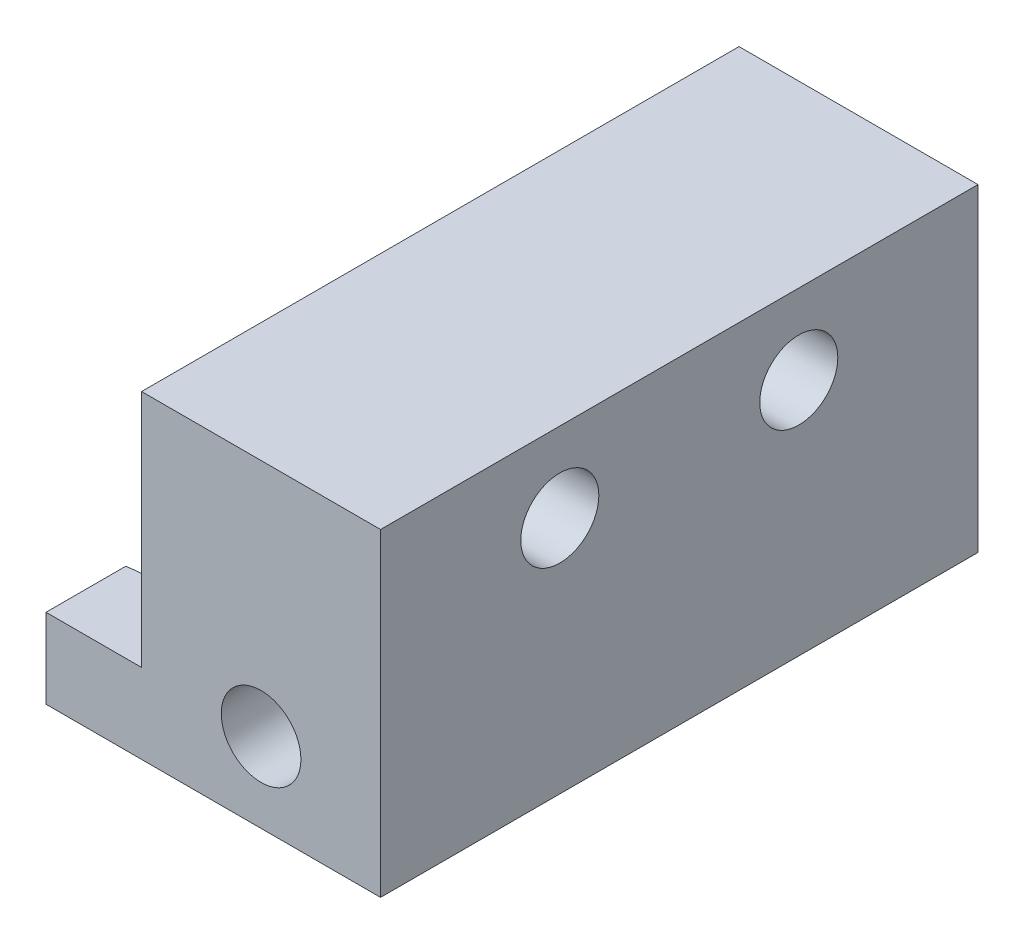
ISO-10303-21;
HEADER;
FILE_DESCRIPTION(('STEP AP214'),'2;1');
FILE_NAME('part.step','',(''),(''),'','','');
FILE_SCHEMA(('AUTOMOTIVE_DESIGN { 1 0 10303 214 1 1 1 1 }'));
ENDSEC;
DATA;
#1=APPLICATION_CONTEXT('core data for automotive mechanical design processes');
#2=APPLICATION_PROTOCOL_DEFINITION('international standard','automotive_design',2000,#1);
#3=PRODUCT_CONTEXT('',#1,'mechanical');
#4=PRODUCT('Part','Part','',(#3));
#5=PRODUCT_RELATED_PRODUCT_CATEGORY('part','',(#4));
#6=PRODUCT_DEFINITION_FORMATION('','',#4);
#7=PRODUCT_DEFINITION_CONTEXT('part definition',#1,'design');
#8=PRODUCT_DEFINITION('design','',#6,#7);
#9=PRODUCT_DEFINITION_SHAPE('','',#8);
#10=(LENGTH_UNIT() NAMED_UNIT(*) SI_UNIT(.MILLI.,.METRE.));
#11=(NAMED_UNIT(*) PLANE_ANGLE_UNIT() SI_UNIT($,.RADIAN.));
#12=(NAMED_UNIT(*) SI_UNIT($,.STERADIAN.) SOLID_ANGLE_UNIT());
#13=UNCERTAINTY_MEASURE_WITH_UNIT(LENGTH_MEASURE(1.E-05),#10,'distance_accuracy_value','');
#14=(GEOMETRIC_REPRESENTATION_CONTEXT(3) GLOBAL_UNCERTAINTY_ASSIGNED_CONTEXT((#13)) GLOBAL_UNIT_ASSIGNED_CONTEXT((#10,
#11,#12)) REPRESENTATION_CONTEXT('',''));
#15=CARTESIAN_POINT('',(0.,0.,0.));
#16=DIRECTION('',(0.,0.,1.));
#17=DIRECTION('',(1.,0.,0.));
#18=AXIS2_PLACEMENT_3D('',#15,#16,#17);
#19=CARTESIAN_POINT('',(0.,-20.,0.));
#20=DIRECTION('',(0.,1.,0.));
#21=DIRECTION('',(0.,0.,1.));
#22=AXIS2_PLACEMENT_3D('',#19,#20,#21);
#23=PLANE('',#22);
#24=CARTESIAN_POINT('',(-25.,-20.,-15.5999999999997));
#25=DIRECTION('',(0.,1.,0.));
#26=DIRECTION('',(0.,0.,1.));
#27=AXIS2_PLACEMENT_3D('',#24,#25,#26);
#28=CIRCLE('',#27,10.1000000000003);
#29=CARTESIAN_POINT('',(-27.,-20.,-25.5));
#30=VERTEX_POINT('',#29);
#31=CARTESIAN_POINT('',(-25.,-20.,-25.7));
#32=VERTEX_POINT('',#31);
#33=EDGE_CURVE('E194',#30,#32,#28,.F.);
#34=ORIENTED_EDGE('',*,*,#33,.T.);
#35=CARTESIAN_POINT('',(-25.,-20.,-25.5));
#36=DIRECTION('',(0.,1.,0.));
#37=DIRECTION('',(0.,0.,1.));
#38=AXIS2_PLACEMENT_3D('',#35,#36,#37);
#39=CIRCLE('',#38,0.199999999999997);
#40=CARTESIAN_POINT('',(-24.8,-20.,-25.5));
#41=VERTEX_POINT('',#40);
#42=EDGE_CURVE('E349',#32,#41,#39,.F.);
#43=ORIENTED_EDGE('',*,*,#42,.T.);
#44=DIRECTION('',(1.,0.,0.));
#45=VECTOR('',#44,1.);
#46=CARTESIAN_POINT('',(0.,-20.,-25.5));
#47=LINE('',#46,#45);
#48=CARTESIAN_POINT('',(-15.,-20.,-25.5));
#49=VERTEX_POINT('',#48);
#50=EDGE_CURVE('E355',#41,#49,#47,.T.);
#51=ORIENTED_EDGE('',*,*,#50,.T.);
#52=DIRECTION('',(0.,0.,1.));
#53=VECTOR('',#52,1.);
#54=CARTESIAN_POINT('',(-15.,-20.,0.));
#55=LINE('',#54,#53);
#56=CARTESIAN_POINT('',(-15.,-20.,-27.5));
#57=VERTEX_POINT('',#56);
#58=EDGE_CURVE('E477',#57,#49,#55,.T.);
#59=ORIENTED_EDGE('',*,*,#58,.F.);
#60=DIRECTION('',(1.,0.,0.));
#61=VECTOR('',#60,1.);
#62=CARTESIAN_POINT('',(0.,-20.,-27.5));
#63=LINE('',#62,#61);
#64=CARTESIAN_POINT('',(-24.8,-20.,-27.5));
#65=VERTEX_POINT('',#64);
#66=EDGE_CURVE('E471',#65,#57,#63,.T.);
#67=ORIENTED_EDGE('',*,*,#66,.F.);
#68=CARTESIAN_POINT('',(-25.,-20.,-27.5));
#69=DIRECTION('',(0.,1.,0.));
#70=DIRECTION('',(0.,0.,1.));
#71=AXIS2_PLACEMENT_3D('',#68,#69,#70);
#72=CIRCLE('',#71,0.199999999999997);
#73=CARTESIAN_POINT('',(-25.,-20.,-27.3));
#74=VERTEX_POINT('',#73);
#75=EDGE_CURVE('E467',#74,#65,#72,.T.);
#76=ORIENTED_EDGE('',*,*,#75,.F.);
#77=CARTESIAN_POINT('',(-25.,-20.,-37.4000000000002));
#78=DIRECTION('',(0.,1.,0.));
#79=DIRECTION('',(0.,0.,1.));
#80=AXIS2_PLACEMENT_3D('',#77,#78,#79);
#81=CIRCLE('',#80,10.1000000000003);
#82=CARTESIAN_POINT('',(-27.,-20.,-27.5));
#83=VERTEX_POINT('',#82);
#84=EDGE_CURVE('E206',#83,#74,#81,.T.);
#85=ORIENTED_EDGE('',*,*,#84,.F.);
#86=DIRECTION('',(0.,0.,-1.));
#87=VECTOR('',#86,1.);
#88=CARTESIAN_POINT('',(-27.,-20.,0.));
#89=LINE('',#88,#87);
#90=CARTESIAN_POINT('',(-27.,-20.,-37.5));
#91=VERTEX_POINT('',#90);
#92=EDGE_CURVE('E225',#83,#91,#89,.T.);
#93=ORIENTED_EDGE('',*,*,#92,.T.);
#94=DIRECTION('',(-1.,0.,0.));
#95=VECTOR('',#94,1.);
#96=CARTESIAN_POINT('',(-15.,-20.,-37.5));
#97=LINE('',#96,#95);
#98=CARTESIAN_POINT('',(15.,-20.,-37.5));
#99=VERTEX_POINT('',#98);
#100=EDGE_CURVE('E287',#99,#91,#97,.T.);
#101=ORIENTED_EDGE('',*,*,#100,.F.);
#102=DIRECTION('',(0.,0.,-1.));
#103=VECTOR('',#102,1.);
#104=CARTESIAN_POINT('',(15.,-20.,-37.5));
#105=LINE('',#104,#103);
#106=CARTESIAN_POINT('',(15.,-20.,37.5));
#107=VERTEX_POINT('',#106);
#108=EDGE_CURVE('E268',#107,#99,#105,.T.);
#109=ORIENTED_EDGE('',*,*,#108,.F.);
#110=DIRECTION('',(1.,0.,0.));
#111=VECTOR('',#110,1.);
#112=CARTESIAN_POINT('',(-15.,-20.,37.5));
#113=LINE('',#112,#111);
#114=CARTESIAN_POINT('',(-27.,-20.,37.5));
#115=VERTEX_POINT('',#114);
#116=EDGE_CURVE('E274',#115,#107,#113,.T.);
#117=ORIENTED_EDGE('',*,*,#116,.F.);
#118=CARTESIAN_POINT('',(-27.,-20.,27.5));
#119=VERTEX_POINT('',#118);
#120=EDGE_CURVE('E224',#115,#119,#89,.T.);
#121=ORIENTED_EDGE('',*,*,#120,.T.);
#122=CARTESIAN_POINT('',(-25.,-20.,37.4000000000002));
#123=DIRECTION('',(0.,-1.,0.));
#124=DIRECTION('',(0.,0.,-1.));
#125=AXIS2_PLACEMENT_3D('',#122,#123,#124);
#126=CIRCLE('',#125,10.1000000000003);
#127=CARTESIAN_POINT('',(-25.,-20.,27.3));
#128=VERTEX_POINT('',#127);
#129=EDGE_CURVE('E390',#119,#128,#126,.T.);
#130=ORIENTED_EDGE('',*,*,#129,.T.);
#131=CARTESIAN_POINT('',(-25.,-20.,27.5));
#132=DIRECTION('',(0.,-1.,0.));
#133=DIRECTION('',(0.,0.,-1.));
#134=AXIS2_PLACEMENT_3D('',#131,#132,#133);
#135=CIRCLE('',#134,0.199999999999997);
#136=CARTESIAN_POINT('',(-24.8,-20.,27.5));
#137=VERTEX_POINT('',#136);
#138=EDGE_CURVE('E386',#128,#137,#135,.T.);
#139=ORIENTED_EDGE('',*,*,#138,.T.);
#140=DIRECTION('',(1.,0.,0.));
#141=VECTOR('',#140,1.);
#142=CARTESIAN_POINT('',(0.,-20.,27.5));
#143=LINE('',#142,#141);
#144=CARTESIAN_POINT('',(-15.,-20.,27.5));
#145=VERTEX_POINT('',#144);
#146=EDGE_CURVE('E382',#137,#145,#143,.T.);
#147=ORIENTED_EDGE('',*,*,#146,.T.);
#148=DIRECTION('',(0.,0.,-1.));
#149=VECTOR('',#148,1.);
#150=CARTESIAN_POINT('',(-15.,-20.,0.));
#151=LINE('',#150,#149);
#152=CARTESIAN_POINT('',(-15.,-20.,25.5));
#153=VERTEX_POINT('',#152);
#154=EDGE_CURVE('E378',#145,#153,#151,.T.);
#155=ORIENTED_EDGE('',*,*,#154,.T.);
#156=DIRECTION('',(1.,0.,0.));
#157=VECTOR('',#156,1.);
#158=CARTESIAN_POINT('',(0.,-20.,25.5));
#159=LINE('',#158,#157);
#160=CARTESIAN_POINT('',(-24.8,-20.,25.5));
#161=VERTEX_POINT('',#160);
#162=EDGE_CURVE('E374',#161,#153,#159,.T.);
#163=ORIENTED_EDGE('',*,*,#162,.F.);
#164=CARTESIAN_POINT('',(-25.,-20.,25.5));
#165=DIRECTION('',(0.,-1.,0.));
#166=DIRECTION('',(0.,0.,-1.));
#167=AXIS2_PLACEMENT_3D('',#164,#165,#166);
#168=CIRCLE('',#167,0.199999999999997);
#169=CARTESIAN_POINT('',(-25.,-20.,25.7));
#170=VERTEX_POINT('',#169);
#171=EDGE_CURVE('E371',#170,#161,#168,.F.);
#172=ORIENTED_EDGE('',*,*,#171,.F.);
#173=CARTESIAN_POINT('',(-25.,-20.,15.5999999999997));
#174=DIRECTION('',(0.,-1.,0.));
#175=DIRECTION('',(0.,0.,-1.));
#176=AXIS2_PLACEMENT_3D('',#173,#174,#175);
#177=CIRCLE('',#176,10.1000000000003);
#178=CARTESIAN_POINT('',(-27.,-20.,25.5));
#179=VERTEX_POINT('',#178);
#180=EDGE_CURVE('E222',#179,#170,#177,.F.);
#181=ORIENTED_EDGE('',*,*,#180,.F.);
#182=EDGE_CURVE('E213',#179,#30,#89,.T.);
#183=ORIENTED_EDGE('',*,*,#182,.T.);
#184=EDGE_LOOP('',(#34,#43,#51,#59,#67,#76,#85,#93,#101,#109,#117,#121,#130,#139,#147,#155,#163,
#172,#181,#183));
#185=FACE_BOUND('',#184,.T.);
#186=ADVANCED_FACE('F45',(#185),#23,.F.);
#187=CARTESIAN_POINT('',(0.,-10.,0.));
#188=DIRECTION('',(0.,-1.,0.));
#189=DIRECTION('',(0.,0.,-1.));
#190=AXIS2_PLACEMENT_3D('',#187,#188,#189);
#191=PLANE('',#190);
#192=CARTESIAN_POINT('',(-25.,-10.,-15.5999999999997));
#193=DIRECTION('',(0.,-1.,0.));
#194=DIRECTION('',(0.,0.,-1.));
#195=AXIS2_PLACEMENT_3D('',#192,#193,#194);
#196=CIRCLE('',#195,10.1000000000003);
#197=CARTESIAN_POINT('',(-27.,-10.,-25.5));
#198=VERTEX_POINT('',#197);
#199=CARTESIAN_POINT('',(-25.,-10.,-25.7));
#200=VERTEX_POINT('',#199);
#201=EDGE_CURVE('E361',#198,#200,#196,.T.);
#202=ORIENTED_EDGE('',*,*,#201,.F.);
#203=DIRECTION('',(0.,0.,-1.));
#204=VECTOR('',#203,1.);
#205=CARTESIAN_POINT('',(-27.,-10.,0.));
#206=LINE('',#205,#204);
#207=CARTESIAN_POINT('',(-27.,-10.,25.5));
#208=VERTEX_POINT('',#207);
#209=EDGE_CURVE('E215',#208,#198,#206,.T.);
#210=ORIENTED_EDGE('',*,*,#209,.F.);
#211=CARTESIAN_POINT('',(-25.,-10.,15.5999999999997));
#212=DIRECTION('',(0.,-1.,0.));
#213=DIRECTION('',(0.,0.,-1.));
#214=AXIS2_PLACEMENT_3D('',#211,#212,#213);
#215=CIRCLE('',#214,10.1000000000003);
#216=CARTESIAN_POINT('',(-25.,-10.,25.7));
#217=VERTEX_POINT('',#216);
#218=EDGE_CURVE('E316',#208,#217,#215,.F.);
#219=ORIENTED_EDGE('',*,*,#218,.T.);
#220=CARTESIAN_POINT('',(-25.,-10.,25.5));
#221=DIRECTION('',(0.,-1.,0.));
#222=DIRECTION('',(0.,0.,-1.));
#223=AXIS2_PLACEMENT_3D('',#220,#221,#222);
#224=CIRCLE('',#223,0.199999999999997);
#225=CARTESIAN_POINT('',(-24.8,-10.,25.5));
#226=VERTEX_POINT('',#225);
#227=EDGE_CURVE('E308',#217,#226,#224,.F.);
#228=ORIENTED_EDGE('',*,*,#227,.T.);
#229=DIRECTION('',(1.,0.,0.));
#230=VECTOR('',#229,1.);
#231=CARTESIAN_POINT('',(0.,-10.,25.5));
#232=LINE('',#231,#230);
#233=CARTESIAN_POINT('',(-15.,-10.,25.5));
#234=VERTEX_POINT('',#233);
#235=EDGE_CURVE('E312',#226,#234,#232,.T.);
#236=ORIENTED_EDGE('',*,*,#235,.T.);
#237=DIRECTION('',(0.,0.,-1.));
#238=VECTOR('',#237,1.);
#239=CARTESIAN_POINT('',(-15.,-10.,0.));
#240=LINE('',#239,#238);
#241=CARTESIAN_POINT('',(-15.,-10.,-25.5));
#242=VERTEX_POINT('',#241);
#243=EDGE_CURVE('E431',#234,#242,#240,.T.);
#244=ORIENTED_EDGE('',*,*,#243,.T.);
#245=DIRECTION('',(1.,0.,0.));
#246=VECTOR('',#245,1.);
#247=CARTESIAN_POINT('',(0.,-10.,-25.5));
#248=LINE('',#247,#246);
#249=CARTESIAN_POINT('',(-24.8,-10.,-25.5));
#250=VERTEX_POINT('',#249);
#251=EDGE_CURVE('E366',#250,#242,#248,.T.);
#252=ORIENTED_EDGE('',*,*,#251,.F.);
#253=CARTESIAN_POINT('',(-25.,-10.,-25.5));
#254=DIRECTION('',(0.,-1.,0.));
#255=DIRECTION('',(0.,0.,-1.));
#256=AXIS2_PLACEMENT_3D('',#253,#254,#255);
#257=CIRCLE('',#256,0.199999999999997);
#258=EDGE_CURVE('E11',#200,#250,#257,.T.);
#259=ORIENTED_EDGE('',*,*,#258,.F.);
#260=EDGE_LOOP('',(#202,#210,#219,#228,#236,#244,#252,#259));
#261=FACE_BOUND('',#260,.T.);
#262=ADVANCED_FACE('F503',(#261),#191,.F.);
#263=CARTESIAN_POINT('',(-27.,-10.,0.));
#264=DIRECTION('',(-1.,0.,0.));
#265=DIRECTION('',(0.,0.,1.));
#266=AXIS2_PLACEMENT_3D('',#263,#264,#265);
#267=PLANE('',#266);
#268=ORIENTED_EDGE('',*,*,#209,.T.);
#269=DIRECTION('',(0.,-1.,0.));
#270=VECTOR('',#269,1.);
#271=CARTESIAN_POINT('',(-27.,20.,-25.5));
#272=LINE('',#271,#270);
#273=EDGE_CURVE('E197',#198,#30,#272,.T.);
#274=ORIENTED_EDGE('',*,*,#273,.T.);
#275=ORIENTED_EDGE('',*,*,#182,.F.);
#276=DIRECTION('',(0.,-1.,0.));
#277=VECTOR('',#276,1.);
#278=CARTESIAN_POINT('',(-27.,20.,25.5));
#279=LINE('',#278,#277);
#280=EDGE_CURVE('E231',#208,#179,#279,.T.);
#281=ORIENTED_EDGE('',*,*,#280,.F.);
#282=EDGE_LOOP('',(#268,#274,#275,#281));
#283=FACE_BOUND('',#282,.T.);
#284=ADVANCED_FACE('F211',(#283),#267,.T.);
#285=CARTESIAN_POINT('',(-27.,-10.,37.5));
#286=VERTEX_POINT('',#285);
#287=CARTESIAN_POINT('',(-27.,-10.,27.5));
#288=VERTEX_POINT('',#287);
#289=EDGE_CURVE('E421',#286,#288,#206,.T.);
#290=ORIENTED_EDGE('',*,*,#289,.T.);
#291=DIRECTION('',(0.,-1.,0.));
#292=VECTOR('',#291,1.);
#293=CARTESIAN_POINT('',(-27.,20.,27.5));
#294=LINE('',#293,#292);
#295=EDGE_CURVE('E397',#288,#119,#294,.T.);
#296=ORIENTED_EDGE('',*,*,#295,.T.);
#297=ORIENTED_EDGE('',*,*,#120,.F.);
#298=DIRECTION('',(0.,-1.,0.));
#299=VECTOR('',#298,1.);
#300=CARTESIAN_POINT('',(-27.,-10.,37.5));
#301=LINE('',#300,#299);
#302=EDGE_CURVE('E241',#286,#115,#301,.T.);
#303=ORIENTED_EDGE('',*,*,#302,.F.);
#304=EDGE_LOOP('',(#290,#296,#297,#303));
#305=FACE_BOUND('',#304,.T.);
#306=ADVANCED_FACE('F518',(#305),#267,.T.);
#307=CARTESIAN_POINT('',(-25.,-10.,-27.5));
#308=DIRECTION('',(0.,-1.,0.));
#309=DIRECTION('',(0.,0.,-1.));
#310=AXIS2_PLACEMENT_3D('',#307,#308,#309);
#311=CIRCLE('',#310,0.199999999999997);
#312=CARTESIAN_POINT('',(-25.,-10.,-27.3));
#313=VERTEX_POINT('',#312);
#314=CARTESIAN_POINT('',(-24.8,-10.,-27.5));
#315=VERTEX_POINT('',#314);
#316=EDGE_CURVE('E54',#313,#315,#311,.F.);
#317=ORIENTED_EDGE('',*,*,#316,.T.);
#318=DIRECTION('',(1.,0.,0.));
#319=VECTOR('',#318,1.);
#320=CARTESIAN_POINT('',(0.,-10.,-27.5));
#321=LINE('',#320,#319);
#322=CARTESIAN_POINT('',(-15.,-10.,-27.5));
#323=VERTEX_POINT('',#322);
#324=EDGE_CURVE('E335',#315,#323,#321,.T.);
#325=ORIENTED_EDGE('',*,*,#324,.T.);
#326=CARTESIAN_POINT('',(-15.,-10.,-37.5));
#327=VERTEX_POINT('',#326);
#328=EDGE_CURVE('E427',#323,#327,#240,.T.);
#329=ORIENTED_EDGE('',*,*,#328,.T.);
#330=DIRECTION('',(-1.,0.,0.));
#331=VECTOR('',#330,1.);
#332=CARTESIAN_POINT('',(0.,-10.,-37.5));
#333=LINE('',#332,#331);
#334=CARTESIAN_POINT('',(-27.,-10.,-37.5));
#335=VERTEX_POINT('',#334);
#336=EDGE_CURVE('E424',#327,#335,#333,.T.);
#337=ORIENTED_EDGE('',*,*,#336,.T.);
#338=CARTESIAN_POINT('',(-27.,-10.,-27.5));
#339=VERTEX_POINT('',#338);
#340=EDGE_CURVE('E420',#339,#335,#206,.T.);
#341=ORIENTED_EDGE('',*,*,#340,.F.);
#342=CARTESIAN_POINT('',(-25.,-10.,-37.4000000000002));
#343=DIRECTION('',(0.,-1.,0.));
#344=DIRECTION('',(0.,0.,-1.));
#345=AXIS2_PLACEMENT_3D('',#342,#343,#344);
#346=CIRCLE('',#345,10.1000000000003);
#347=EDGE_CURVE('E61',#339,#313,#346,.F.);
#348=ORIENTED_EDGE('',*,*,#347,.T.);
#349=EDGE_LOOP('',(#317,#325,#329,#337,#341,#348));
#350=FACE_BOUND('',#349,.T.);
#351=ADVANCED_FACE('F334',(#350),#191,.F.);
#352=CARTESIAN_POINT('',(-15.,20.,-37.5));
#353=DIRECTION('',(1.,0.,0.));
#354=DIRECTION('',(0.,0.,-1.));
#355=AXIS2_PLACEMENT_3D('',#352,#353,#354);
#356=PLANE('',#355);
#357=ORIENTED_EDGE('',*,*,#328,.F.);
#358=DIRECTION('',(0.,-1.,0.));
#359=VECTOR('',#358,1.);
#360=CARTESIAN_POINT('',(-15.,20.,-27.5));
#361=LINE('',#360,#359);
#362=EDGE_CURVE('E353',#323,#57,#361,.T.);
#363=ORIENTED_EDGE('',*,*,#362,.T.);
#364=ORIENTED_EDGE('',*,*,#58,.T.);
#365=DIRECTION('',(0.,-1.,0.));
#366=VECTOR('',#365,1.);
#367=CARTESIAN_POINT('',(-15.,20.,-25.5));
#368=LINE('',#367,#366);
#369=EDGE_CURVE('E489',#242,#49,#368,.T.);
#370=ORIENTED_EDGE('',*,*,#369,.F.);
#371=ORIENTED_EDGE('',*,*,#243,.F.);
#372=DIRECTION('',(0.,-1.,0.));
#373=VECTOR('',#372,1.);
#374=CARTESIAN_POINT('',(-15.,20.,25.5));
#375=LINE('',#374,#373);
#376=EDGE_CURVE('E410',#234,#153,#375,.T.);
#377=ORIENTED_EDGE('',*,*,#376,.T.);
#378=ORIENTED_EDGE('',*,*,#154,.F.);
#379=DIRECTION('',(0.,-1.,0.));
#380=VECTOR('',#379,1.);
#381=CARTESIAN_POINT('',(-15.,20.,27.5));
#382=LINE('',#381,#380);
#383=CARTESIAN_POINT('',(-15.,-10.,27.5));
#384=VERTEX_POINT('',#383);
#385=EDGE_CURVE('E407',#384,#145,#382,.T.);
#386=ORIENTED_EDGE('',*,*,#385,.F.);
#387=CARTESIAN_POINT('',(-15.,-10.,37.5));
#388=VERTEX_POINT('',#387);
#389=EDGE_CURVE('E234',#388,#384,#240,.T.);
#390=ORIENTED_EDGE('',*,*,#389,.F.);
#391=DIRECTION('',(0.,-1.,0.));
#392=VECTOR('',#391,1.);
#393=CARTESIAN_POINT('',(-15.,20.,37.5));
#394=LINE('',#393,#392);
#395=CARTESIAN_POINT('',(-15.,20.,37.5));
#396=VERTEX_POINT('',#395);
#397=EDGE_CURVE('E296',#396,#388,#394,.T.);
#398=ORIENTED_EDGE('',*,*,#397,.F.);
#399=DIRECTION('',(0.,0.,1.));
#400=VECTOR('',#399,1.);
#401=CARTESIAN_POINT('',(-15.,20.,-37.5));
#402=LINE('',#401,#400);
#403=CARTESIAN_POINT('',(-15.,20.,-37.5));
#404=VERTEX_POINT('',#403);
#405=EDGE_CURVE('E277',#404,#396,#402,.T.);
#406=ORIENTED_EDGE('',*,*,#405,.F.);
#407=DIRECTION('',(0.,-1.,0.));
#408=VECTOR('',#407,1.);
#409=CARTESIAN_POINT('',(-15.,20.,-37.5));
#410=LINE('',#409,#408);
#411=EDGE_CURVE('E300',#404,#327,#410,.T.);
#412=ORIENTED_EDGE('',*,*,#411,.T.);
#413=EDGE_LOOP('',(#357,#363,#364,#370,#371,#377,#378,#386,#390,#398,#406,#412));
#414=FACE_BOUND('',#413,.T.);
#415=CARTESIAN_POINT('',(-15.,10.,-15.));
#416=DIRECTION('',(1.,0.,0.));
#417=DIRECTION('',(0.,0.,-1.));
#418=AXIS2_PLACEMENT_3D('',#415,#416,#417);
#419=CIRCLE('',#418,4.9);
#420=CARTESIAN_POINT('',(-15.,10.,-19.9));
#421=VERTEX_POINT('',#420);
#422=EDGE_CURVE('E240',#421,#421,#419,.F.);
#423=ORIENTED_EDGE('',*,*,#422,.F.);
#424=EDGE_LOOP('',(#423));
#425=FACE_BOUND('',#424,.T.);
#426=CARTESIAN_POINT('',(-15.,10.,15.));
#427=DIRECTION('',(1.,0.,0.));
#428=DIRECTION('',(0.,0.,-1.));
#429=AXIS2_PLACEMENT_3D('',#426,#427,#428);
#430=CIRCLE('',#429,4.9);
#431=CARTESIAN_POINT('',(-15.,10.,10.1));
#432=VERTEX_POINT('',#431);
#433=EDGE_CURVE('E249',#432,#432,#430,.F.);
#434=ORIENTED_EDGE('',*,*,#433,.F.);
#435=EDGE_LOOP('',(#434));
#436=FACE_BOUND('',#435,.T.);
#437=ADVANCED_FACE('F446',(#414,#425,#436),#356,.F.);
#438=CARTESIAN_POINT('',(15.,20.,-37.5));
#439=DIRECTION('',(-1.,0.,0.));
#440=DIRECTION('',(0.,0.,1.));
#441=AXIS2_PLACEMENT_3D('',#438,#439,#440);
#442=PLANE('',#441);
#443=CARTESIAN_POINT('',(15.,10.,15.));
#444=DIRECTION('',(1.,0.,0.));
#445=DIRECTION('',(0.,0.,-1.));
#446=AXIS2_PLACEMENT_3D('',#443,#444,#445);
#447=CIRCLE('',#446,4.9);
#448=CARTESIAN_POINT('',(15.,10.,10.1));
#449=VERTEX_POINT('',#448);
#450=EDGE_CURVE('E245',#449,#449,#447,.T.);
#451=ORIENTED_EDGE('',*,*,#450,.F.);
#452=EDGE_LOOP('',(#451));
#453=FACE_BOUND('',#452,.T.);
#454=CARTESIAN_POINT('',(15.,10.,-15.));
#455=DIRECTION('',(1.,0.,0.));
#456=DIRECTION('',(0.,0.,-1.));
#457=AXIS2_PLACEMENT_3D('',#454,#455,#456);
#458=CIRCLE('',#457,4.9);
#459=CARTESIAN_POINT('',(15.,10.,-19.9));
#460=VERTEX_POINT('',#459);
#461=EDGE_CURVE('E250',#460,#460,#458,.T.);
#462=ORIENTED_EDGE('',*,*,#461,.F.);
#463=EDGE_LOOP('',(#462));
#464=FACE_BOUND('',#463,.T.);
#465=ORIENTED_EDGE('',*,*,#108,.T.);
#466=DIRECTION('',(0.,-1.,0.));
#467=VECTOR('',#466,1.);
#468=CARTESIAN_POINT('',(15.,20.,-37.5));
#469=LINE('',#468,#467);
#470=CARTESIAN_POINT('',(15.,20.,-37.5));
#471=VERTEX_POINT('',#470);
#472=EDGE_CURVE('E304',#471,#99,#469,.T.);
#473=ORIENTED_EDGE('',*,*,#472,.F.);
#474=DIRECTION('',(0.,0.,-1.));
#475=VECTOR('',#474,1.);
#476=CARTESIAN_POINT('',(15.,20.,-37.5));
#477=LINE('',#476,#475);
#478=CARTESIAN_POINT('',(15.,20.,37.5));
#479=VERTEX_POINT('',#478);
#480=EDGE_CURVE('E269',#479,#471,#477,.T.);
#481=ORIENTED_EDGE('',*,*,#480,.F.);
#482=DIRECTION('',(0.,-1.,0.));
#483=VECTOR('',#482,1.);
#484=CARTESIAN_POINT('',(15.,20.,37.5));
#485=LINE('',#484,#483);
#486=EDGE_CURVE('E283',#479,#107,#485,.T.);
#487=ORIENTED_EDGE('',*,*,#486,.T.);
#488=EDGE_LOOP('',(#465,#473,#481,#487));
#489=FACE_BOUND('',#488,.T.);
#490=ADVANCED_FACE('F47',(#453,#464,#489),#442,.F.);
#491=CARTESIAN_POINT('',(-15.,20.,-37.5));
#492=DIRECTION('',(0.,0.,1.));
#493=DIRECTION('',(1.,0.,0.));
#494=AXIS2_PLACEMENT_3D('',#491,#492,#493);
#495=PLANE('',#494);
#496=CARTESIAN_POINT('',(0.,-10.,-37.5));
#497=DIRECTION('',(0.,0.,1.));
#498=DIRECTION('',(1.,0.,0.));
#499=AXIS2_PLACEMENT_3D('',#496,#497,#498);
#500=CIRCLE('',#499,5.);
#501=CARTESIAN_POINT('',(5.,-10.,-37.5));
#502=VERTEX_POINT('',#501);
#503=EDGE_CURVE('E264',#502,#502,#500,.F.);
#504=ORIENTED_EDGE('',*,*,#503,.F.);
#505=EDGE_LOOP('',(#504));
#506=FACE_BOUND('',#505,.T.);
#507=ORIENTED_EDGE('',*,*,#100,.T.);
#508=DIRECTION('',(0.,-1.,0.));
#509=VECTOR('',#508,1.);
#510=CARTESIAN_POINT('',(-27.,-10.,-37.5));
#511=LINE('',#510,#509);
#512=EDGE_CURVE('E236',#335,#91,#511,.T.);
#513=ORIENTED_EDGE('',*,*,#512,.F.);
#514=ORIENTED_EDGE('',*,*,#336,.F.);
#515=ORIENTED_EDGE('',*,*,#411,.F.);
#516=DIRECTION('',(-1.,0.,0.));
#517=VECTOR('',#516,1.);
#518=CARTESIAN_POINT('',(-15.,20.,-37.5));
#519=LINE('',#518,#517);
#520=EDGE_CURVE('E273',#471,#404,#519,.T.);
#521=ORIENTED_EDGE('',*,*,#520,.F.);
#522=ORIENTED_EDGE('',*,*,#472,.T.);
#523=EDGE_LOOP('',(#507,#513,#514,#515,#521,#522));
#524=FACE_BOUND('',#523,.T.);
#525=ADVANCED_FACE('F460',(#506,#524),#495,.F.);
#526=CARTESIAN_POINT('',(-15.,20.,37.5));
#527=DIRECTION('',(0.,0.,-1.));
#528=DIRECTION('',(-1.,0.,0.));
#529=AXIS2_PLACEMENT_3D('',#526,#527,#528);
#530=PLANE('',#529);
#531=CARTESIAN_POINT('',(0.,-10.,37.5));
#532=DIRECTION('',(0.,0.,1.));
#533=DIRECTION('',(1.,0.,0.));
#534=AXIS2_PLACEMENT_3D('',#531,#532,#533);
#535=CIRCLE('',#534,5.);
#536=CARTESIAN_POINT('',(5.,-10.,37.5));
#537=VERTEX_POINT('',#536);
#538=EDGE_CURVE('E254',#537,#537,#535,.T.);
#539=ORIENTED_EDGE('',*,*,#538,.F.);
#540=EDGE_LOOP('',(#539));
#541=FACE_BOUND('',#540,.T.);
#542=ORIENTED_EDGE('',*,*,#116,.T.);
#543=ORIENTED_EDGE('',*,*,#486,.F.);
#544=DIRECTION('',(1.,0.,0.));
#545=VECTOR('',#544,1.);
#546=CARTESIAN_POINT('',(-15.,20.,37.5));
#547=LINE('',#546,#545);
#548=EDGE_CURVE('E280',#396,#479,#547,.T.);
#549=ORIENTED_EDGE('',*,*,#548,.F.);
#550=ORIENTED_EDGE('',*,*,#397,.T.);
#551=DIRECTION('',(-1.,0.,0.));
#552=VECTOR('',#551,1.);
#553=CARTESIAN_POINT('',(0.,-10.,37.5));
#554=LINE('',#553,#552);
#555=EDGE_CURVE('E230',#388,#286,#554,.T.);
#556=ORIENTED_EDGE('',*,*,#555,.T.);
#557=ORIENTED_EDGE('',*,*,#302,.T.);
#558=EDGE_LOOP('',(#542,#543,#549,#550,#556,#557));
#559=FACE_BOUND('',#558,.T.);
#560=ADVANCED_FACE('F452',(#541,#559),#530,.F.);
#561=CARTESIAN_POINT('',(0.,20.,0.));
#562=DIRECTION('',(0.,1.,0.));
#563=DIRECTION('',(0.,0.,1.));
#564=AXIS2_PLACEMENT_3D('',#561,#562,#563);
#565=PLANE('',#564);
#566=ORIENTED_EDGE('',*,*,#480,.T.);
#567=ORIENTED_EDGE('',*,*,#520,.T.);
#568=ORIENTED_EDGE('',*,*,#405,.T.);
#569=ORIENTED_EDGE('',*,*,#548,.T.);
#570=EDGE_LOOP('',(#566,#567,#568,#569));
#571=FACE_BOUND('',#570,.T.);
#572=ADVANCED_FACE('F456',(#571),#565,.T.);
#573=CARTESIAN_POINT('',(0.,-10.,-37.501));
#574=DIRECTION('',(0.,0.,1.));
#575=DIRECTION('',(1.,0.,0.));
#576=AXIS2_PLACEMENT_3D('',#573,#574,#575);
#577=CYLINDRICAL_SURFACE('',#576,5.);
#578=ORIENTED_EDGE('',*,*,#538,.T.);
#579=EDGE_LOOP('',(#578));
#580=FACE_BOUND('',#579,.T.);
#581=ORIENTED_EDGE('',*,*,#503,.T.);
#582=EDGE_LOOP('',(#581));
#583=FACE_BOUND('',#582,.T.);
#584=ADVANCED_FACE('F546',(#580,#583),#577,.F.);
#585=CARTESIAN_POINT('',(-15.001,10.,-15.));
#586=DIRECTION('',(1.,0.,0.));
#587=DIRECTION('',(0.,0.,-1.));
#588=AXIS2_PLACEMENT_3D('',#585,#586,#587);
#589=CYLINDRICAL_SURFACE('',#588,4.9);
#590=CARTESIAN_POINT('',(15.,10.,-19.9));
#591=CARTESIAN_POINT('',(14.6875,10.,-19.9));
#592=CARTESIAN_POINT('',(14.375,10.,-19.9));
#593=CARTESIAN_POINT('',(13.75,10.,-19.9));
#594=CARTESIAN_POINT('',(13.4375,10.,-19.9));
#595=CARTESIAN_POINT('',(12.8125,10.,-19.9));
#596=CARTESIAN_POINT('',(12.5,10.,-19.9));
#597=CARTESIAN_POINT('',(11.875,10.,-19.9));
#598=CARTESIAN_POINT('',(11.5625,10.,-19.9));
#599=CARTESIAN_POINT('',(10.9375,10.,-19.9));
#600=CARTESIAN_POINT('',(10.625,10.,-19.9));
#601=CARTESIAN_POINT('',(10.,10.,-19.9));
#602=CARTESIAN_POINT('',(9.6875,10.,-19.9));
#603=CARTESIAN_POINT('',(9.0625,10.,-19.9));
#604=CARTESIAN_POINT('',(8.75,10.,-19.9));
#605=CARTESIAN_POINT('',(8.125,10.,-19.9));
#606=CARTESIAN_POINT('',(7.8125,10.,-19.9));
#607=CARTESIAN_POINT('',(7.1875,10.,-19.9));
#608=CARTESIAN_POINT('',(6.875,10.,-19.9));
#609=CARTESIAN_POINT('',(6.25,10.,-19.9));
#610=CARTESIAN_POINT('',(5.9375,10.,-19.9));
#611=CARTESIAN_POINT('',(5.3125,10.,-19.9));
#612=CARTESIAN_POINT('',(5.,10.,-19.9));
#613=CARTESIAN_POINT('',(4.375,10.,-19.9));
#614=CARTESIAN_POINT('',(4.0625,10.,-19.9));
#615=CARTESIAN_POINT('',(3.4375,10.,-19.9));
#616=CARTESIAN_POINT('',(3.125,10.,-19.9));
#617=CARTESIAN_POINT('',(2.5,10.,-19.9));
#618=CARTESIAN_POINT('',(2.1875,10.,-19.9));
#619=CARTESIAN_POINT('',(1.5625,10.,-19.9));
#620=CARTESIAN_POINT('',(1.25,10.,-19.9));
#621=CARTESIAN_POINT('',(0.625000000000001,10.,-19.9));
#622=CARTESIAN_POINT('',(0.3125,10.,-19.9));
#623=CARTESIAN_POINT('',(-0.3125,10.,-19.9));
#624=CARTESIAN_POINT('',(-0.624999999999999,10.,-19.9));
#625=CARTESIAN_POINT('',(-1.25,10.,-19.9));
#626=CARTESIAN_POINT('',(-1.5625,10.,-19.9));
#627=CARTESIAN_POINT('',(-2.1875,10.,-19.9));
#628=CARTESIAN_POINT('',(-2.5,10.,-19.9));
#629=CARTESIAN_POINT('',(-3.125,10.,-19.9));
#630=CARTESIAN_POINT('',(-3.4375,10.,-19.9));
#631=CARTESIAN_POINT('',(-4.0625,10.,-19.9));
#632=CARTESIAN_POINT('',(-4.375,10.,-19.9));
#633=CARTESIAN_POINT('',(-5.,10.,-19.9));
#634=CARTESIAN_POINT('',(-5.3125,10.,-19.9));
#635=CARTESIAN_POINT('',(-5.9375,10.,-19.9));
#636=CARTESIAN_POINT('',(-6.25,10.,-19.9));
#637=CARTESIAN_POINT('',(-6.875,10.,-19.9));
#638=CARTESIAN_POINT('',(-7.1875,10.,-19.9));
#639=CARTESIAN_POINT('',(-7.8125,10.,-19.9));
#640=CARTESIAN_POINT('',(-8.125,10.,-19.9));
#641=CARTESIAN_POINT('',(-8.75,10.,-19.9));
#642=CARTESIAN_POINT('',(-9.0625,10.,-19.9));
#643=CARTESIAN_POINT('',(-9.6875,10.,-19.9));
#644=CARTESIAN_POINT('',(-10.,10.,-19.9));
#645=CARTESIAN_POINT('',(-10.625,10.,-19.9));
#646=CARTESIAN_POINT('',(-10.9375,10.,-19.9));
#647=CARTESIAN_POINT('',(-11.5625,10.,-19.9));
#648=CARTESIAN_POINT('',(-11.875,10.,-19.9));
#649=CARTESIAN_POINT('',(-12.5,10.,-19.9));
#650=CARTESIAN_POINT('',(-12.8125,10.,-19.9));
#651=CARTESIAN_POINT('',(-13.4375,10.,-19.9));
#652=CARTESIAN_POINT('',(-13.75,10.,-19.9));
#653=CARTESIAN_POINT('',(-14.375,10.,-19.9));
#654=CARTESIAN_POINT('',(-14.6875,10.,-19.9));
#655=CARTESIAN_POINT('',(-15.,10.,-19.9));
#656=B_SPLINE_CURVE_WITH_KNOTS('',3,(#590,#591,#592,#593,#594,#595,#596,#597,#598,#599,#600,
#601,#602,#603,#604,#605,#606,#607,#608,#609,#610,#611,#612,#613,#614,#615,#616,#617,#618,#619,
#620,#621,#622,#623,#624,#625,#626,#627,#628,#629,#630,#631,#632,#633,#634,#635,#636,#637,#638,
#639,#640,#641,#642,#643,#644,#645,#646,#647,#648,#649,#650,#651,#652,#653,#654,#655),
.UNSPECIFIED.,.F.,.F.,(4,2,2,2,2,2,2,2,2,2,2,2,2,2,2,2,2,2,2,2,2,2,2,2,2,2,2,2,2,2,2,2,4),(0.,
0.937500000000001,1.875,2.8125,3.75,4.6875,5.625,6.5625,7.5,8.4375,9.375,10.3125,11.25,12.1875,
13.125,14.0625,15.,15.9375,16.875,17.8125,18.75,19.6875,20.625,21.5625,22.5,23.4375,24.375,
25.3125,26.25,27.1875,28.125,29.0625,30.),.UNSPECIFIED.);
#657=EDGE_CURVE('BSEAM551',#460,#421,#656,.T.);
#658=ORIENTED_EDGE('',*,*,#461,.T.);
#659=ORIENTED_EDGE('',*,*,#422,.T.);
#660=ORIENTED_EDGE('',*,*,#657,.T.);
#661=ORIENTED_EDGE('',*,*,#657,.F.);
#662=EDGE_LOOP('',(#658,#660,#659,#661));
#663=FACE_BOUND('',#662,.T.);
#664=ADVANCED_FACE('F551',(#663),#589,.F.);
#665=CARTESIAN_POINT('',(-15.001,10.,15.));
#666=DIRECTION('',(1.,0.,0.));
#667=DIRECTION('',(0.,0.,-1.));
#668=AXIS2_PLACEMENT_3D('',#665,#666,#667);
#669=CYLINDRICAL_SURFACE('',#668,4.9);
#670=CARTESIAN_POINT('',(15.,10.,10.1));
#671=CARTESIAN_POINT('',(14.6875,10.,10.1));
#672=CARTESIAN_POINT('',(14.375,10.,10.1));
#673=CARTESIAN_POINT('',(13.75,10.,10.1));
#674=CARTESIAN_POINT('',(13.4375,10.,10.1));
#675=CARTESIAN_POINT('',(12.8125,10.,10.1));
#676=CARTESIAN_POINT('',(12.5,10.,10.1));
#677=CARTESIAN_POINT('',(11.875,10.,10.1));
#678=CARTESIAN_POINT('',(11.5625,10.,10.1));
#679=CARTESIAN_POINT('',(10.9375,10.,10.1));
#680=CARTESIAN_POINT('',(10.625,10.,10.1));
#681=CARTESIAN_POINT('',(10.,10.,10.1));
#682=CARTESIAN_POINT('',(9.6875,10.,10.1));
#683=CARTESIAN_POINT('',(9.0625,10.,10.1));
#684=CARTESIAN_POINT('',(8.75,10.,10.1));
#685=CARTESIAN_POINT('',(8.125,10.,10.1));
#686=CARTESIAN_POINT('',(7.8125,10.,10.1));
#687=CARTESIAN_POINT('',(7.1875,10.,10.1));
#688=CARTESIAN_POINT('',(6.875,10.,10.1));
#689=CARTESIAN_POINT('',(6.25,10.,10.1));
#690=CARTESIAN_POINT('',(5.9375,10.,10.1));
#691=CARTESIAN_POINT('',(5.3125,10.,10.1));
#692=CARTESIAN_POINT('',(5.,10.,10.1));
#693=CARTESIAN_POINT('',(4.375,10.,10.1));
#694=CARTESIAN_POINT('',(4.0625,10.,10.1));
#695=CARTESIAN_POINT('',(3.4375,10.,10.1));
#696=CARTESIAN_POINT('',(3.125,10.,10.1));
#697=CARTESIAN_POINT('',(2.5,10.,10.1));
#698=CARTESIAN_POINT('',(2.1875,10.,10.1));
#699=CARTESIAN_POINT('',(1.5625,10.,10.1));
#700=CARTESIAN_POINT('',(1.25,10.,10.1));
#701=CARTESIAN_POINT('',(0.625000000000004,10.,10.1));
#702=CARTESIAN_POINT('',(0.312500000000004,10.,10.1));
#703=CARTESIAN_POINT('',(-0.312499999999996,10.,10.1));
#704=CARTESIAN_POINT('',(-0.624999999999996,10.,10.1));
#705=CARTESIAN_POINT('',(-1.25,10.,10.1));
#706=CARTESIAN_POINT('',(-1.5625,10.,10.1));
#707=CARTESIAN_POINT('',(-2.1875,10.,10.1));
#708=CARTESIAN_POINT('',(-2.5,10.,10.1));
#709=CARTESIAN_POINT('',(-3.125,10.,10.1));
#710=CARTESIAN_POINT('',(-3.4375,10.,10.1));
#711=CARTESIAN_POINT('',(-4.0625,10.,10.1));
#712=CARTESIAN_POINT('',(-4.375,10.,10.1));
#713=CARTESIAN_POINT('',(-5.,10.,10.1));
#714=CARTESIAN_POINT('',(-5.3125,10.,10.1));
#715=CARTESIAN_POINT('',(-5.9375,10.,10.1));
#716=CARTESIAN_POINT('',(-6.25,10.,10.1));
#717=CARTESIAN_POINT('',(-6.875,10.,10.1));
#718=CARTESIAN_POINT('',(-7.1875,10.,10.1));
#719=CARTESIAN_POINT('',(-7.8125,10.,10.1));
#720=CARTESIAN_POINT('',(-8.125,10.,10.1));
#721=CARTESIAN_POINT('',(-8.75,10.,10.1));
#722=CARTESIAN_POINT('',(-9.0625,10.,10.1));
#723=CARTESIAN_POINT('',(-9.68749999999999,10.,10.1));
#724=CARTESIAN_POINT('',(-9.99999999999999,10.,10.1));
#725=CARTESIAN_POINT('',(-10.625,10.,10.1));
#726=CARTESIAN_POINT('',(-10.9375,10.,10.1));
#727=CARTESIAN_POINT('',(-11.5625,10.,10.1));
#728=CARTESIAN_POINT('',(-11.875,10.,10.1));
#729=CARTESIAN_POINT('',(-12.5,10.,10.1));
#730=CARTESIAN_POINT('',(-12.8125,10.,10.1));
#731=CARTESIAN_POINT('',(-13.4375,10.,10.1));
#732=CARTESIAN_POINT('',(-13.75,10.,10.1));
#733=CARTESIAN_POINT('',(-14.375,10.,10.1));
#734=CARTESIAN_POINT('',(-14.6875,10.,10.1));
#735=CARTESIAN_POINT('',(-15.,10.,10.1));
#736=B_SPLINE_CURVE_WITH_KNOTS('',3,(#670,#671,#672,#673,#674,#675,#676,#677,#678,#679,#680,
#681,#682,#683,#684,#685,#686,#687,#688,#689,#690,#691,#692,#693,#694,#695,#696,#697,#698,#699,
#700,#701,#702,#703,#704,#705,#706,#707,#708,#709,#710,#711,#712,#713,#714,#715,#716,#717,#718,
#719,#720,#721,#722,#723,#724,#725,#726,#727,#728,#729,#730,#731,#732,#733,#734,#735),
.UNSPECIFIED.,.F.,.F.,(4,2,2,2,2,2,2,2,2,2,2,2,2,2,2,2,2,2,2,2,2,2,2,2,2,2,2,2,2,2,2,2,4),(0.,
0.937500000000001,1.875,2.8125,3.75,4.6875,5.625,6.5625,7.5,8.4375,9.375,10.3125,11.25,12.1875,
13.125,14.0625,15.,15.9375,16.875,17.8125,18.75,19.6875,20.625,21.5625,22.5,23.4375,24.375,
25.3125,26.25,27.1875,28.125,29.0625,30.),.UNSPECIFIED.);
#737=EDGE_CURVE('BSEAM556',#449,#432,#736,.T.);
#738=ORIENTED_EDGE('',*,*,#450,.T.);
#739=ORIENTED_EDGE('',*,*,#433,.T.);
#740=ORIENTED_EDGE('',*,*,#737,.T.);
#741=ORIENTED_EDGE('',*,*,#737,.F.);
#742=EDGE_LOOP('',(#738,#740,#739,#741));
#743=FACE_BOUND('',#742,.T.);
#744=ADVANCED_FACE('F556',(#743),#669,.F.);
#745=DIRECTION('',(0.,-1.,0.));
#746=VECTOR('',#745,1.);
#747=CARTESIAN_POINT('',(-27.,20.,-27.5));
#748=LINE('',#747,#746);
#749=EDGE_CURVE('E217',#339,#83,#748,.T.);
#750=ORIENTED_EDGE('',*,*,#749,.F.);
#751=ORIENTED_EDGE('',*,*,#340,.T.);
#752=ORIENTED_EDGE('',*,*,#512,.T.);
#753=ORIENTED_EDGE('',*,*,#92,.F.);
#754=EDGE_LOOP('',(#750,#751,#752,#753));
#755=FACE_BOUND('',#754,.T.);
#756=ADVANCED_FACE('F463',(#755),#267,.T.);
#757=CARTESIAN_POINT('',(-25.,-10.,37.4000000000002));
#758=DIRECTION('',(0.,-1.,0.));
#759=DIRECTION('',(0.,0.,-1.));
#760=AXIS2_PLACEMENT_3D('',#757,#758,#759);
#761=CIRCLE('',#760,10.1000000000003);
#762=CARTESIAN_POINT('',(-25.,-10.,27.3));
#763=VERTEX_POINT('',#762);
#764=EDGE_CURVE('E326',#288,#763,#761,.T.);
#765=ORIENTED_EDGE('',*,*,#764,.F.);
#766=ORIENTED_EDGE('',*,*,#289,.F.);
#767=ORIENTED_EDGE('',*,*,#555,.F.);
#768=ORIENTED_EDGE('',*,*,#389,.T.);
#769=DIRECTION('',(1.,0.,0.));
#770=VECTOR('',#769,1.);
#771=CARTESIAN_POINT('',(0.,-10.,27.5));
#772=LINE('',#771,#770);
#773=CARTESIAN_POINT('',(-24.8,-10.,27.5));
#774=VERTEX_POINT('',#773);
#775=EDGE_CURVE('E320',#774,#384,#772,.T.);
#776=ORIENTED_EDGE('',*,*,#775,.F.);
#777=CARTESIAN_POINT('',(-25.,-10.,27.5));
#778=DIRECTION('',(0.,-1.,0.));
#779=DIRECTION('',(0.,0.,-1.));
#780=AXIS2_PLACEMENT_3D('',#777,#778,#779);
#781=CIRCLE('',#780,0.199999999999997);
#782=EDGE_CURVE('E323',#763,#774,#781,.T.);
#783=ORIENTED_EDGE('',*,*,#782,.F.);
#784=EDGE_LOOP('',(#765,#766,#767,#768,#776,#783));
#785=FACE_BOUND('',#784,.T.);
#786=ADVANCED_FACE('F440',(#785),#191,.F.);
#787=CARTESIAN_POINT('',(-25.,20.,15.5999999999997));
#788=DIRECTION('',(0.,-1.,0.));
#789=DIRECTION('',(0.,0.,-1.));
#790=AXIS2_PLACEMENT_3D('',#787,#788,#789);
#791=CYLINDRICAL_SURFACE('',#790,10.1000000000003);
#792=ORIENTED_EDGE('',*,*,#280,.T.);
#793=ORIENTED_EDGE('',*,*,#180,.T.);
#794=DIRECTION('',(0.,-1.,0.));
#795=VECTOR('',#794,1.);
#796=CARTESIAN_POINT('',(-25.,20.,25.7));
#797=LINE('',#796,#795);
#798=EDGE_CURVE('E394',#217,#170,#797,.T.);
#799=ORIENTED_EDGE('',*,*,#798,.F.);
#800=ORIENTED_EDGE('',*,*,#218,.F.);
#801=EDGE_LOOP('',(#792,#793,#799,#800));
#802=FACE_BOUND('',#801,.T.);
#803=ADVANCED_FACE('F566',(#802),#791,.T.);
#804=CARTESIAN_POINT('',(-25.,20.,37.4000000000002));
#805=DIRECTION('',(0.,-1.,0.));
#806=DIRECTION('',(0.,0.,-1.));
#807=AXIS2_PLACEMENT_3D('',#804,#805,#806);
#808=CYLINDRICAL_SURFACE('',#807,10.1000000000003);
#809=ORIENTED_EDGE('',*,*,#764,.T.);
#810=DIRECTION('',(0.,-1.,0.));
#811=VECTOR('',#810,1.);
#812=CARTESIAN_POINT('',(-25.,20.,27.3));
#813=LINE('',#812,#811);
#814=EDGE_CURVE('E401',#763,#128,#813,.T.);
#815=ORIENTED_EDGE('',*,*,#814,.T.);
#816=ORIENTED_EDGE('',*,*,#129,.F.);
#817=ORIENTED_EDGE('',*,*,#295,.F.);
#818=EDGE_LOOP('',(#809,#815,#816,#817));
#819=FACE_BOUND('',#818,.T.);
#820=ADVANCED_FACE('F569',(#819),#808,.T.);
#821=CARTESIAN_POINT('',(-25.,20.,27.5));
#822=DIRECTION('',(0.,-1.,0.));
#823=DIRECTION('',(0.,0.,-1.));
#824=AXIS2_PLACEMENT_3D('',#821,#822,#823);
#825=CYLINDRICAL_SURFACE('',#824,0.199999999999997);
#826=ORIENTED_EDGE('',*,*,#782,.T.);
#827=DIRECTION('',(0.,-1.,0.));
#828=VECTOR('',#827,1.);
#829=CARTESIAN_POINT('',(-24.8,20.,27.5));
#830=LINE('',#829,#828);
#831=EDGE_CURVE('E404',#774,#137,#830,.T.);
#832=ORIENTED_EDGE('',*,*,#831,.T.);
#833=ORIENTED_EDGE('',*,*,#138,.F.);
#834=ORIENTED_EDGE('',*,*,#814,.F.);
#835=EDGE_LOOP('',(#826,#832,#833,#834));
#836=FACE_BOUND('',#835,.T.);
#837=ADVANCED_FACE('F514',(#836),#825,.T.);
#838=CARTESIAN_POINT('',(0.,20.,27.5));
#839=DIRECTION('',(0.,0.,-1.));
#840=DIRECTION('',(-1.,0.,0.));
#841=AXIS2_PLACEMENT_3D('',#838,#839,#840);
#842=PLANE('',#841);
#843=ORIENTED_EDGE('',*,*,#775,.T.);
#844=ORIENTED_EDGE('',*,*,#385,.T.);
#845=ORIENTED_EDGE('',*,*,#146,.F.);
#846=ORIENTED_EDGE('',*,*,#831,.F.);
#847=EDGE_LOOP('',(#843,#844,#845,#846));
#848=FACE_BOUND('',#847,.T.);
#849=ADVANCED_FACE('F512',(#848),#842,.T.);
#850=CARTESIAN_POINT('',(0.,20.,25.5));
#851=DIRECTION('',(0.,0.,-1.));
#852=DIRECTION('',(-1.,0.,0.));
#853=AXIS2_PLACEMENT_3D('',#850,#851,#852);
#854=PLANE('',#853);
#855=DIRECTION('',(0.,-1.,0.));
#856=VECTOR('',#855,1.);
#857=CARTESIAN_POINT('',(-24.8,20.,25.5));
#858=LINE('',#857,#856);
#859=EDGE_CURVE('E69',#226,#161,#858,.T.);
#860=ORIENTED_EDGE('',*,*,#859,.T.);
#861=ORIENTED_EDGE('',*,*,#162,.T.);
#862=ORIENTED_EDGE('',*,*,#376,.F.);
#863=ORIENTED_EDGE('',*,*,#235,.F.);
#864=EDGE_LOOP('',(#860,#861,#862,#863));
#865=FACE_BOUND('',#864,.T.);
#866=ADVANCED_FACE('F506',(#865),#854,.F.);
#867=CARTESIAN_POINT('',(-25.,20.,25.5));
#868=DIRECTION('',(0.,-1.,0.));
#869=DIRECTION('',(0.,0.,-1.));
#870=AXIS2_PLACEMENT_3D('',#867,#868,#869);
#871=CYLINDRICAL_SURFACE('',#870,0.199999999999997);
#872=ORIENTED_EDGE('',*,*,#798,.T.);
#873=ORIENTED_EDGE('',*,*,#171,.T.);
#874=ORIENTED_EDGE('',*,*,#859,.F.);
#875=ORIENTED_EDGE('',*,*,#227,.F.);
#876=EDGE_LOOP('',(#872,#873,#874,#875));
#877=FACE_BOUND('',#876,.T.);
#878=ADVANCED_FACE('F571',(#877),#871,.T.);
#879=CARTESIAN_POINT('',(-25.,20.,-25.5));
#880=DIRECTION('',(0.,-1.,0.));
#881=DIRECTION('',(0.,0.,-1.));
#882=AXIS2_PLACEMENT_3D('',#879,#880,#881);
#883=CYLINDRICAL_SURFACE('',#882,0.199999999999997);
#884=ORIENTED_EDGE('',*,*,#258,.T.);
#885=DIRECTION('',(0.,-1.,0.));
#886=VECTOR('',#885,1.);
#887=CARTESIAN_POINT('',(-24.8,20.,-25.5));
#888=LINE('',#887,#886);
#889=EDGE_CURVE('E486',#250,#41,#888,.T.);
#890=ORIENTED_EDGE('',*,*,#889,.T.);
#891=ORIENTED_EDGE('',*,*,#42,.F.);
#892=DIRECTION('',(0.,-1.,0.));
#893=VECTOR('',#892,1.);
#894=CARTESIAN_POINT('',(-25.,20.,-25.7));
#895=LINE('',#894,#893);
#896=EDGE_CURVE('E200',#200,#32,#895,.T.);
#897=ORIENTED_EDGE('',*,*,#896,.F.);
#898=EDGE_LOOP('',(#884,#890,#891,#897));
#899=FACE_BOUND('',#898,.T.);
#900=ADVANCED_FACE('F574',(#899),#883,.T.);
#901=CARTESIAN_POINT('',(-25.,20.,-27.5));
#902=DIRECTION('',(0.,-1.,0.));
#903=DIRECTION('',(0.,0.,-1.));
#904=AXIS2_PLACEMENT_3D('',#901,#902,#903);
#905=CYLINDRICAL_SURFACE('',#904,0.199999999999997);
#906=DIRECTION('',(0.,-1.,0.));
#907=VECTOR('',#906,1.);
#908=CARTESIAN_POINT('',(-25.,20.,-27.3));
#909=LINE('',#908,#907);
#910=EDGE_CURVE('E342',#313,#74,#909,.T.);
#911=ORIENTED_EDGE('',*,*,#910,.T.);
#912=ORIENTED_EDGE('',*,*,#75,.T.);
#913=DIRECTION('',(0.,-1.,0.));
#914=VECTOR('',#913,1.);
#915=CARTESIAN_POINT('',(-24.8,20.,-27.5));
#916=LINE('',#915,#914);
#917=EDGE_CURVE('E344',#315,#65,#916,.T.);
#918=ORIENTED_EDGE('',*,*,#917,.F.);
#919=ORIENTED_EDGE('',*,*,#316,.F.);
#920=EDGE_LOOP('',(#911,#912,#918,#919));
#921=FACE_BOUND('',#920,.T.);
#922=ADVANCED_FACE('F340',(#921),#905,.T.);
#923=CARTESIAN_POINT('',(0.,20.,-25.5));
#924=DIRECTION('',(0.,0.,-1.));
#925=DIRECTION('',(-1.,0.,0.));
#926=AXIS2_PLACEMENT_3D('',#923,#924,#925);
#927=PLANE('',#926);
#928=ORIENTED_EDGE('',*,*,#251,.T.);
#929=ORIENTED_EDGE('',*,*,#369,.T.);
#930=ORIENTED_EDGE('',*,*,#50,.F.);
#931=ORIENTED_EDGE('',*,*,#889,.F.);
#932=EDGE_LOOP('',(#928,#929,#930,#931));
#933=FACE_BOUND('',#932,.T.);
#934=ADVANCED_FACE('F499',(#933),#927,.T.);
#935=CARTESIAN_POINT('',(0.,20.,-27.5));
#936=DIRECTION('',(0.,0.,-1.));
#937=DIRECTION('',(-1.,0.,0.));
#938=AXIS2_PLACEMENT_3D('',#935,#936,#937);
#939=PLANE('',#938);
#940=ORIENTED_EDGE('',*,*,#917,.T.);
#941=ORIENTED_EDGE('',*,*,#66,.T.);
#942=ORIENTED_EDGE('',*,*,#362,.F.);
#943=ORIENTED_EDGE('',*,*,#324,.F.);
#944=EDGE_LOOP('',(#940,#941,#942,#943));
#945=FACE_BOUND('',#944,.T.);
#946=ADVANCED_FACE('F495',(#945),#939,.F.);
#947=CARTESIAN_POINT('',(-25.,20.,-15.5999999999997));
#948=DIRECTION('',(0.,-1.,0.));
#949=DIRECTION('',(0.,0.,-1.));
#950=AXIS2_PLACEMENT_3D('',#947,#948,#949);
#951=CYLINDRICAL_SURFACE('',#950,10.1000000000003);
#952=ORIENTED_EDGE('',*,*,#201,.T.);
#953=ORIENTED_EDGE('',*,*,#896,.T.);
#954=ORIENTED_EDGE('',*,*,#33,.F.);
#955=ORIENTED_EDGE('',*,*,#273,.F.);
#956=EDGE_LOOP('',(#952,#953,#954,#955));
#957=FACE_BOUND('',#956,.T.);
#958=ADVANCED_FACE('F196',(#957),#951,.T.);
#959=CARTESIAN_POINT('',(-25.,20.,-37.4000000000002));
#960=DIRECTION('',(0.,-1.,0.));
#961=DIRECTION('',(0.,0.,-1.));
#962=AXIS2_PLACEMENT_3D('',#959,#960,#961);
#963=CYLINDRICAL_SURFACE('',#962,10.1000000000003);
#964=ORIENTED_EDGE('',*,*,#749,.T.);
#965=ORIENTED_EDGE('',*,*,#84,.T.);
#966=ORIENTED_EDGE('',*,*,#910,.F.);
#967=ORIENTED_EDGE('',*,*,#347,.F.);
#968=EDGE_LOOP('',(#964,#965,#966,#967));
#969=FACE_BOUND('',#968,.T.);
#970=ADVANCED_FACE('F345',(#969),#963,.T.);
#971=CLOSED_SHELL('',(#186,#262,#284,#306,#351,#437,#490,#525,#560,#572,#584,#664,#744,#756,
#786,#803,#820,#837,#849,#866,#878,#900,#922,#934,#946,#958,#970));
#972=MANIFOLD_SOLID_BREP('B2',#971);
#973=ADVANCED_BREP_SHAPE_REPRESENTATION('',(#18,#972),#14);
#974=SHAPE_DEFINITION_REPRESENTATION(#9,#973);
ENDSEC;
END-ISO-10303-21;
